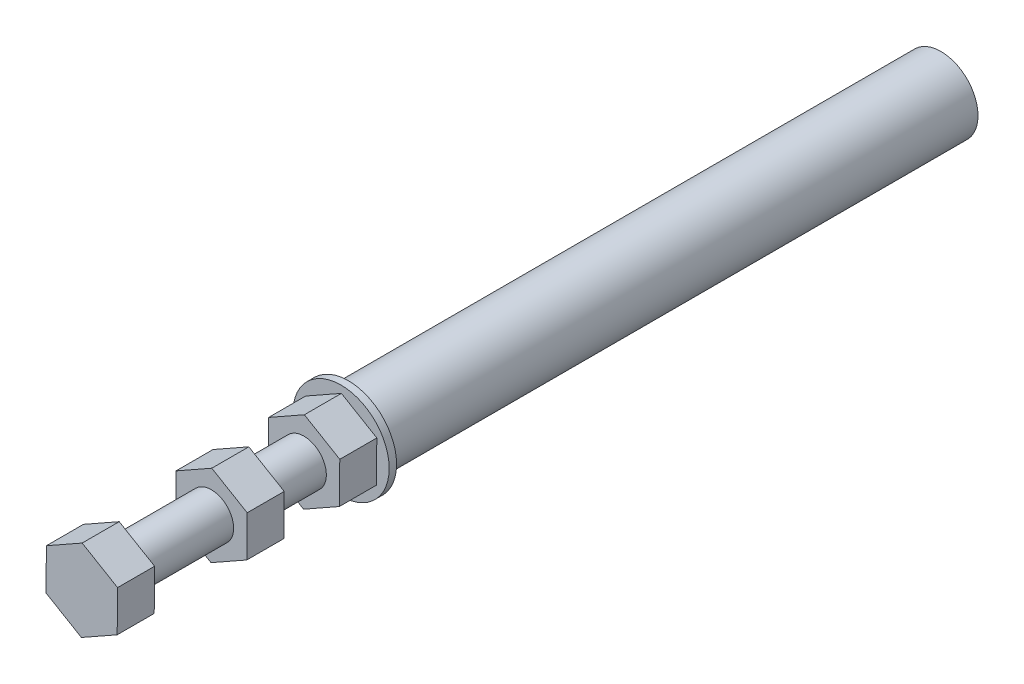
ISO-10303-21;
HEADER;
FILE_DESCRIPTION(('STEP AP214'),'2;1');
FILE_NAME('part.step','',(''),(''),'','','');
FILE_SCHEMA(('AUTOMOTIVE_DESIGN { 1 0 10303 214 1 1 1 1 }'));
ENDSEC;
DATA;
#1=APPLICATION_CONTEXT('core data for automotive mechanical design processes');
#2=APPLICATION_PROTOCOL_DEFINITION('international standard','automotive_design',2000,#1);
#3=PRODUCT_CONTEXT('',#1,'mechanical');
#4=PRODUCT('Part','Part','',(#3));
#5=PRODUCT_RELATED_PRODUCT_CATEGORY('part','',(#4));
#6=PRODUCT_DEFINITION_FORMATION('','',#4);
#7=PRODUCT_DEFINITION_CONTEXT('part definition',#1,'design');
#8=PRODUCT_DEFINITION('design','',#6,#7);
#9=PRODUCT_DEFINITION_SHAPE('','',#8);
#10=(LENGTH_UNIT() NAMED_UNIT(*) SI_UNIT(.MILLI.,.METRE.));
#11=(NAMED_UNIT(*) PLANE_ANGLE_UNIT() SI_UNIT($,.RADIAN.));
#12=(NAMED_UNIT(*) SI_UNIT($,.STERADIAN.) SOLID_ANGLE_UNIT());
#13=UNCERTAINTY_MEASURE_WITH_UNIT(LENGTH_MEASURE(1.E-05),#10,'distance_accuracy_value','');
#14=(GEOMETRIC_REPRESENTATION_CONTEXT(3) GLOBAL_UNCERTAINTY_ASSIGNED_CONTEXT((#13)) GLOBAL_UNIT_ASSIGNED_CONTEXT((#10,
#11,#12)) REPRESENTATION_CONTEXT('',''));
#15=CARTESIAN_POINT('',(0.,0.,0.));
#16=DIRECTION('',(0.,0.,1.));
#17=DIRECTION('',(1.,0.,0.));
#18=AXIS2_PLACEMENT_3D('',#15,#16,#17);
#19=CARTESIAN_POINT('',(0.,0.,80.));
#20=DIRECTION('',(0.,0.,-1.));
#21=DIRECTION('',(-1.,0.,0.));
#22=AXIS2_PLACEMENT_3D('',#19,#20,#21);
#23=CYLINDRICAL_SURFACE('',#22,5.);
#24=CARTESIAN_POINT('',(0.,0.,80.));
#25=DIRECTION('',(0.,0.,1.));
#26=DIRECTION('',(1.,0.,0.));
#27=AXIS2_PLACEMENT_3D('',#24,#25,#26);
#28=CIRCLE('',#27,5.);
#29=CARTESIAN_POINT('',(5.,0.,80.));
#30=VERTEX_POINT('',#29);
#31=EDGE_CURVE('E271',#30,#30,#28,.T.);
#32=ORIENTED_EDGE('',*,*,#31,.F.);
#33=EDGE_LOOP('',(#32));
#34=FACE_BOUND('',#33,.T.);
#35=CARTESIAN_POINT('',(0.,0.,0.));
#36=DIRECTION('',(0.,0.,1.));
#37=DIRECTION('',(1.,0.,0.));
#38=AXIS2_PLACEMENT_3D('',#35,#36,#37);
#39=CIRCLE('',#38,5.);
#40=CARTESIAN_POINT('',(5.,0.,0.));
#41=VERTEX_POINT('',#40);
#42=EDGE_CURVE('E42',#41,#41,#39,.T.);
#43=ORIENTED_EDGE('',*,*,#42,.T.);
#44=EDGE_LOOP('',(#43));
#45=FACE_BOUND('',#44,.T.);
#46=ADVANCED_FACE('F39',(#34,#45),#23,.T.);
#47=CARTESIAN_POINT('',(0.,0.,0.));
#48=DIRECTION('',(0.,0.,1.));
#49=DIRECTION('',(1.,0.,0.));
#50=AXIS2_PLACEMENT_3D('',#47,#48,#49);
#51=PLANE('',#50);
#52=ORIENTED_EDGE('',*,*,#42,.F.);
#53=EDGE_LOOP('',(#52));
#54=FACE_BOUND('',#53,.T.);
#55=ADVANCED_FACE('F350',(#54),#51,.F.);
#56=CARTESIAN_POINT('',(0.,0.,81.));
#57=DIRECTION('',(0.,0.,-1.));
#58=DIRECTION('',(-1.,0.,0.));
#59=AXIS2_PLACEMENT_3D('',#56,#57,#58);
#60=CYLINDRICAL_SURFACE('',#59,6.5);
#61=CARTESIAN_POINT('',(0.,0.,81.));
#62=DIRECTION('',(0.,0.,1.));
#63=DIRECTION('',(1.,0.,0.));
#64=AXIS2_PLACEMENT_3D('',#61,#62,#63);
#65=CIRCLE('',#64,6.5);
#66=CARTESIAN_POINT('',(6.5,0.,81.));
#67=VERTEX_POINT('',#66);
#68=EDGE_CURVE('E335',#67,#67,#65,.T.);
#69=ORIENTED_EDGE('',*,*,#68,.F.);
#70=EDGE_LOOP('',(#69));
#71=FACE_BOUND('',#70,.T.);
#72=CARTESIAN_POINT('',(0.,0.,80.));
#73=DIRECTION('',(0.,0.,1.));
#74=DIRECTION('',(1.,0.,0.));
#75=AXIS2_PLACEMENT_3D('',#72,#73,#74);
#76=CIRCLE('',#75,6.5);
#77=CARTESIAN_POINT('',(6.5,0.,80.));
#78=VERTEX_POINT('',#77);
#79=EDGE_CURVE('E334',#78,#78,#76,.T.);
#80=ORIENTED_EDGE('',*,*,#79,.T.);
#81=EDGE_LOOP('',(#80));
#82=FACE_BOUND('',#81,.T.);
#83=ADVANCED_FACE('F352',(#71,#82),#60,.T.);
#84=CARTESIAN_POINT('',(0.,0.,81.));
#85=DIRECTION('',(0.,0.,1.));
#86=DIRECTION('',(1.,0.,0.));
#87=AXIS2_PLACEMENT_3D('',#84,#85,#86);
#88=PLANE('',#87);
#89=DIRECTION('',(0.870752902483043,0.491720838298883,0.));
#90=VECTOR('',#89,1.);
#91=CARTESIAN_POINT('',(-0.0529019779904913,-5.54868495112976,81.));
#92=LINE('',#91,#90);
#93=CARTESIAN_POINT('',(-0.0529019779904913,-5.54868495112976,81.));
#94=VERTEX_POINT('',#93);
#95=CARTESIAN_POINT('',(4.77885113627954,-2.82015693241509,81.));
#96=VERTEX_POINT('',#95);
#97=EDGE_CURVE('E56',#94,#96,#92,.T.);
#98=ORIENTED_EDGE('',*,*,#97,.F.);
#99=DIRECTION('',(0.861219188778534,-0.508233714819907,0.));
#100=VECTOR('',#99,1.);
#101=CARTESIAN_POINT('',(-4.83175311427003,-2.72852801871466,81.));
#102=LINE('',#101,#100);
#103=CARTESIAN_POINT('',(-4.83175311427003,-2.72852801871466,81.));
#104=VERTEX_POINT('',#103);
#105=EDGE_CURVE('E60',#104,#94,#102,.T.);
#106=ORIENTED_EDGE('',*,*,#105,.F.);
#107=DIRECTION('',(-0.00953371370450832,-0.999954553118791,0.));
#108=VECTOR('',#107,1.);
#109=CARTESIAN_POINT('',(-4.77885113627953,2.82015693241509,81.));
#110=LINE('',#109,#108);
#111=CARTESIAN_POINT('',(-4.77885113627953,2.82015693241509,81.));
#112=VERTEX_POINT('',#111);
#113=EDGE_CURVE('E306',#112,#104,#110,.T.);
#114=ORIENTED_EDGE('',*,*,#113,.F.);
#115=DIRECTION('',(-0.870752902483043,-0.491720838298883,0.));
#116=VECTOR('',#115,1.);
#117=CARTESIAN_POINT('',(0.0529019779904962,5.54868495112976,81.));
#118=LINE('',#117,#116);
#119=CARTESIAN_POINT('',(0.0529019779904962,5.54868495112976,81.));
#120=VERTEX_POINT('',#119);
#121=EDGE_CURVE('E302',#120,#112,#118,.T.);
#122=ORIENTED_EDGE('',*,*,#121,.F.);
#123=DIRECTION('',(-0.861219188778534,0.508233714819908,0.));
#124=VECTOR('',#123,1.);
#125=CARTESIAN_POINT('',(4.83175311427003,2.72852801871466,81.));
#126=LINE('',#125,#124);
#127=CARTESIAN_POINT('',(4.83175311427003,2.72852801871466,81.));
#128=VERTEX_POINT('',#127);
#129=EDGE_CURVE('E298',#128,#120,#126,.T.);
#130=ORIENTED_EDGE('',*,*,#129,.F.);
#131=DIRECTION('',(0.00953371370450816,0.999954553118791,0.));
#132=VECTOR('',#131,1.);
#133=CARTESIAN_POINT('',(4.77885113627954,-2.82015693241509,81.));
#134=LINE('',#133,#132);
#135=EDGE_CURVE('E294',#96,#128,#134,.T.);
#136=ORIENTED_EDGE('',*,*,#135,.F.);
#137=EDGE_LOOP('',(#98,#106,#114,#122,#130,#136));
#138=FACE_BOUND('',#137,.T.);
#139=ORIENTED_EDGE('',*,*,#68,.T.);
#140=EDGE_LOOP('',(#139));
#141=FACE_BOUND('',#140,.T.);
#142=ADVANCED_FACE('F357',(#138,#141),#88,.T.);
#143=CARTESIAN_POINT('',(0.,0.,80.));
#144=DIRECTION('',(0.,0.,1.));
#145=DIRECTION('',(1.,0.,0.));
#146=AXIS2_PLACEMENT_3D('',#143,#144,#145);
#147=PLANE('',#146);
#148=ORIENTED_EDGE('',*,*,#31,.T.);
#149=EDGE_LOOP('',(#148));
#150=FACE_BOUND('',#149,.T.);
#151=ORIENTED_EDGE('',*,*,#79,.F.);
#152=EDGE_LOOP('',(#151));
#153=FACE_BOUND('',#152,.T.);
#154=ADVANCED_FACE('F362',(#150,#153),#147,.F.);
#155=CARTESIAN_POINT('',(-0.0529019779904913,-5.54868495112976,86.));
#156=DIRECTION('',(-0.491720838298883,0.870752902483043,0.));
#157=DIRECTION('',(-0.870752902483043,-0.491720838298883,0.));
#158=AXIS2_PLACEMENT_3D('',#155,#156,#157);
#159=PLANE('',#158);
#160=ORIENTED_EDGE('',*,*,#97,.T.);
#161=DIRECTION('',(0.,0.,-1.));
#162=VECTOR('',#161,1.);
#163=CARTESIAN_POINT('',(4.77885113627954,-2.82015693241509,86.));
#164=LINE('',#163,#162);
#165=CARTESIAN_POINT('',(4.77885113627954,-2.82015693241509,86.));
#166=VERTEX_POINT('',#165);
#167=EDGE_CURVE('E330',#166,#96,#164,.T.);
#168=ORIENTED_EDGE('',*,*,#167,.F.);
#169=DIRECTION('',(0.870752902483043,0.491720838298883,0.));
#170=VECTOR('',#169,1.);
#171=CARTESIAN_POINT('',(-0.0529019779904913,-5.54868495112976,86.));
#172=LINE('',#171,#170);
#173=CARTESIAN_POINT('',(-0.0529019779904913,-5.54868495112976,86.));
#174=VERTEX_POINT('',#173);
#175=EDGE_CURVE('E272',#174,#166,#172,.T.);
#176=ORIENTED_EDGE('',*,*,#175,.F.);
#177=DIRECTION('',(0.,0.,-1.));
#178=VECTOR('',#177,1.);
#179=CARTESIAN_POINT('',(-0.0529019779904913,-5.54868495112976,86.));
#180=LINE('',#179,#178);
#181=EDGE_CURVE('E291',#174,#94,#180,.T.);
#182=ORIENTED_EDGE('',*,*,#181,.T.);
#183=EDGE_LOOP('',(#160,#168,#176,#182));
#184=FACE_BOUND('',#183,.T.);
#185=ADVANCED_FACE('F365',(#184),#159,.F.);
#186=CARTESIAN_POINT('',(4.77885113627954,-2.82015693241509,86.));
#187=DIRECTION('',(-0.999954553118791,0.00953371370450817,0.));
#188=DIRECTION('',(-0.00953371370450817,-0.999954553118791,0.));
#189=AXIS2_PLACEMENT_3D('',#186,#187,#188);
#190=PLANE('',#189);
#191=ORIENTED_EDGE('',*,*,#135,.T.);
#192=DIRECTION('',(0.,0.,-1.));
#193=VECTOR('',#192,1.);
#194=CARTESIAN_POINT('',(4.83175311427003,2.72852801871466,86.));
#195=LINE('',#194,#193);
#196=CARTESIAN_POINT('',(4.83175311427003,2.72852801871466,86.));
#197=VERTEX_POINT('',#196);
#198=EDGE_CURVE('E326',#197,#128,#195,.T.);
#199=ORIENTED_EDGE('',*,*,#198,.F.);
#200=DIRECTION('',(0.00953371370450816,0.999954553118791,0.));
#201=VECTOR('',#200,1.);
#202=CARTESIAN_POINT('',(4.77885113627954,-2.82015693241509,86.));
#203=LINE('',#202,#201);
#204=EDGE_CURVE('E276',#166,#197,#203,.T.);
#205=ORIENTED_EDGE('',*,*,#204,.F.);
#206=ORIENTED_EDGE('',*,*,#167,.T.);
#207=EDGE_LOOP('',(#191,#199,#205,#206));
#208=FACE_BOUND('',#207,.T.);
#209=ADVANCED_FACE('F370',(#208),#190,.F.);
#210=CARTESIAN_POINT('',(4.83175311427003,2.72852801871466,86.));
#211=DIRECTION('',(-0.508233714819908,-0.861219188778535,0.));
#212=DIRECTION('',(0.861219188778535,-0.508233714819908,0.));
#213=AXIS2_PLACEMENT_3D('',#210,#211,#212);
#214=PLANE('',#213);
#215=ORIENTED_EDGE('',*,*,#129,.T.);
#216=DIRECTION('',(0.,0.,-1.));
#217=VECTOR('',#216,1.);
#218=CARTESIAN_POINT('',(0.0529019779904962,5.54868495112976,86.));
#219=LINE('',#218,#217);
#220=CARTESIAN_POINT('',(0.0529019779904962,5.54868495112976,86.));
#221=VERTEX_POINT('',#220);
#222=EDGE_CURVE('E322',#221,#120,#219,.T.);
#223=ORIENTED_EDGE('',*,*,#222,.F.);
#224=DIRECTION('',(-0.861219188778534,0.508233714819908,0.));
#225=VECTOR('',#224,1.);
#226=CARTESIAN_POINT('',(4.83175311427003,2.72852801871466,86.));
#227=LINE('',#226,#225);
#228=EDGE_CURVE('E279',#197,#221,#227,.T.);
#229=ORIENTED_EDGE('',*,*,#228,.F.);
#230=ORIENTED_EDGE('',*,*,#198,.T.);
#231=EDGE_LOOP('',(#215,#223,#229,#230));
#232=FACE_BOUND('',#231,.T.);
#233=ADVANCED_FACE('F374',(#232),#214,.F.);
#234=CARTESIAN_POINT('',(0.0529019779904962,5.54868495112976,86.));
#235=DIRECTION('',(0.491720838298883,-0.870752902483043,0.));
#236=DIRECTION('',(0.870752902483043,0.491720838298883,0.));
#237=AXIS2_PLACEMENT_3D('',#234,#235,#236);
#238=PLANE('',#237);
#239=ORIENTED_EDGE('',*,*,#121,.T.);
#240=DIRECTION('',(0.,0.,-1.));
#241=VECTOR('',#240,1.);
#242=CARTESIAN_POINT('',(-4.77885113627953,2.82015693241509,86.));
#243=LINE('',#242,#241);
#244=CARTESIAN_POINT('',(-4.77885113627953,2.82015693241509,86.));
#245=VERTEX_POINT('',#244);
#246=EDGE_CURVE('E318',#245,#112,#243,.T.);
#247=ORIENTED_EDGE('',*,*,#246,.F.);
#248=DIRECTION('',(-0.870752902483043,-0.491720838298883,0.));
#249=VECTOR('',#248,1.);
#250=CARTESIAN_POINT('',(0.0529019779904962,5.54868495112976,86.));
#251=LINE('',#250,#249);
#252=EDGE_CURVE('E282',#221,#245,#251,.T.);
#253=ORIENTED_EDGE('',*,*,#252,.F.);
#254=ORIENTED_EDGE('',*,*,#222,.T.);
#255=EDGE_LOOP('',(#239,#247,#253,#254));
#256=FACE_BOUND('',#255,.T.);
#257=ADVANCED_FACE('F378',(#256),#238,.F.);
#258=CARTESIAN_POINT('',(-4.77885113627953,2.82015693241509,86.));
#259=DIRECTION('',(0.999954553118791,-0.00953371370450832,0.));
#260=DIRECTION('',(0.00953371370450832,0.999954553118791,0.));
#261=AXIS2_PLACEMENT_3D('',#258,#259,#260);
#262=PLANE('',#261);
#263=ORIENTED_EDGE('',*,*,#113,.T.);
#264=DIRECTION('',(0.,0.,-1.));
#265=VECTOR('',#264,1.);
#266=CARTESIAN_POINT('',(-4.83175311427003,-2.72852801871466,86.));
#267=LINE('',#266,#265);
#268=CARTESIAN_POINT('',(-4.83175311427003,-2.72852801871466,86.));
#269=VERTEX_POINT('',#268);
#270=EDGE_CURVE('E314',#269,#104,#267,.T.);
#271=ORIENTED_EDGE('',*,*,#270,.F.);
#272=DIRECTION('',(-0.00953371370450832,-0.999954553118791,0.));
#273=VECTOR('',#272,1.);
#274=CARTESIAN_POINT('',(-4.77885113627953,2.82015693241509,86.));
#275=LINE('',#274,#273);
#276=EDGE_CURVE('E285',#245,#269,#275,.T.);
#277=ORIENTED_EDGE('',*,*,#276,.F.);
#278=ORIENTED_EDGE('',*,*,#246,.T.);
#279=EDGE_LOOP('',(#263,#271,#277,#278));
#280=FACE_BOUND('',#279,.T.);
#281=ADVANCED_FACE('F382',(#280),#262,.F.);
#282=CARTESIAN_POINT('',(-4.83175311427003,-2.72852801871466,86.));
#283=DIRECTION('',(0.508233714819907,0.861219188778535,0.));
#284=DIRECTION('',(-0.861219188778535,0.508233714819907,0.));
#285=AXIS2_PLACEMENT_3D('',#282,#283,#284);
#286=PLANE('',#285);
#287=ORIENTED_EDGE('',*,*,#105,.T.);
#288=ORIENTED_EDGE('',*,*,#181,.F.);
#289=DIRECTION('',(0.861219188778534,-0.508233714819907,0.));
#290=VECTOR('',#289,1.);
#291=CARTESIAN_POINT('',(-4.83175311427003,-2.72852801871466,86.));
#292=LINE('',#291,#290);
#293=EDGE_CURVE('E288',#269,#174,#292,.T.);
#294=ORIENTED_EDGE('',*,*,#293,.F.);
#295=ORIENTED_EDGE('',*,*,#270,.T.);
#296=EDGE_LOOP('',(#287,#288,#294,#295));
#297=FACE_BOUND('',#296,.T.);
#298=ADVANCED_FACE('F386',(#297),#286,.F.);
#299=CARTESIAN_POINT('',(0.,0.,86.));
#300=DIRECTION('',(0.,0.,1.));
#301=DIRECTION('',(1.,0.,0.));
#302=AXIS2_PLACEMENT_3D('',#299,#300,#301);
#303=PLANE('',#302);
#304=CARTESIAN_POINT('',(0.,0.,86.));
#305=DIRECTION('',(0.,0.,1.));
#306=DIRECTION('',(1.,0.,0.));
#307=AXIS2_PLACEMENT_3D('',#304,#305,#306);
#308=CIRCLE('',#307,3.01965356429047);
#309=CARTESIAN_POINT('',(3.01965356429047,0.,86.));
#310=VERTEX_POINT('',#309);
#311=EDGE_CURVE('E48',#310,#310,#308,.T.);
#312=ORIENTED_EDGE('',*,*,#311,.F.);
#313=EDGE_LOOP('',(#312));
#314=FACE_BOUND('',#313,.T.);
#315=ORIENTED_EDGE('',*,*,#175,.T.);
#316=ORIENTED_EDGE('',*,*,#204,.T.);
#317=ORIENTED_EDGE('',*,*,#228,.T.);
#318=ORIENTED_EDGE('',*,*,#252,.T.);
#319=ORIENTED_EDGE('',*,*,#276,.T.);
#320=ORIENTED_EDGE('',*,*,#293,.T.);
#321=EDGE_LOOP('',(#315,#316,#317,#318,#319,#320));
#322=FACE_BOUND('',#321,.T.);
#323=ADVANCED_FACE('F390',(#314,#322),#303,.T.);
#324=CARTESIAN_POINT('',(0.,0.,93.5));
#325=DIRECTION('',(0.,0.,-1.));
#326=DIRECTION('',(-1.,0.,0.));
#327=AXIS2_PLACEMENT_3D('',#324,#325,#326);
#328=CYLINDRICAL_SURFACE('',#327,3.01965356429047);
#329=CARTESIAN_POINT('',(0.,0.,93.5));
#330=DIRECTION('',(0.,0.,1.));
#331=DIRECTION('',(1.,0.,0.));
#332=AXIS2_PLACEMENT_3D('',#329,#330,#331);
#333=CIRCLE('',#332,3.01965356429047);
#334=CARTESIAN_POINT('',(3.01965356429047,0.,93.5));
#335=VERTEX_POINT('',#334);
#336=EDGE_CURVE('E264',#335,#335,#333,.T.);
#337=ORIENTED_EDGE('',*,*,#336,.F.);
#338=EDGE_LOOP('',(#337));
#339=FACE_BOUND('',#338,.T.);
#340=ORIENTED_EDGE('',*,*,#311,.T.);
#341=EDGE_LOOP('',(#340));
#342=FACE_BOUND('',#341,.T.);
#343=ADVANCED_FACE('F394',(#339,#342),#328,.T.);
#344=CARTESIAN_POINT('',(-0.0529019779904484,-5.54868495112975,98.5));
#345=DIRECTION('',(-0.49172083829889,0.870752902483039,0.));
#346=DIRECTION('',(-0.870752902483039,-0.49172083829889,0.));
#347=AXIS2_PLACEMENT_3D('',#344,#345,#346);
#348=PLANE('',#347);
#349=DIRECTION('',(0.870752902483039,0.49172083829889,0.));
#350=VECTOR('',#349,1.);
#351=CARTESIAN_POINT('',(-0.0529019779904484,-5.54868495112975,93.5));
#352=LINE('',#351,#350);
#353=CARTESIAN_POINT('',(-0.0529019779904484,-5.54868495112975,93.5));
#354=VERTEX_POINT('',#353);
#355=CARTESIAN_POINT('',(4.77885113627956,-2.82015693241505,93.5));
#356=VERTEX_POINT('',#355);
#357=EDGE_CURVE('E197',#354,#356,#352,.T.);
#358=ORIENTED_EDGE('',*,*,#357,.T.);
#359=DIRECTION('',(0.,0.,-1.));
#360=VECTOR('',#359,1.);
#361=CARTESIAN_POINT('',(4.77885113627956,-2.82015693241505,98.5));
#362=LINE('',#361,#360);
#363=CARTESIAN_POINT('',(4.77885113627956,-2.82015693241505,98.5));
#364=VERTEX_POINT('',#363);
#365=EDGE_CURVE('E260',#364,#356,#362,.T.);
#366=ORIENTED_EDGE('',*,*,#365,.F.);
#367=DIRECTION('',(0.870752902483039,0.49172083829889,0.));
#368=VECTOR('',#367,1.);
#369=CARTESIAN_POINT('',(-0.0529019779904484,-5.54868495112975,98.5));
#370=LINE('',#369,#368);
#371=CARTESIAN_POINT('',(-0.0529019779904484,-5.54868495112975,98.5));
#372=VERTEX_POINT('',#371);
#373=EDGE_CURVE('E203',#372,#364,#370,.T.);
#374=ORIENTED_EDGE('',*,*,#373,.F.);
#375=DIRECTION('',(0.,0.,-1.));
#376=VECTOR('',#375,1.);
#377=CARTESIAN_POINT('',(-0.0529019779904484,-5.54868495112975,98.5));
#378=LINE('',#377,#376);
#379=EDGE_CURVE('E223',#372,#354,#378,.T.);
#380=ORIENTED_EDGE('',*,*,#379,.T.);
#381=EDGE_LOOP('',(#358,#366,#374,#380));
#382=FACE_BOUND('',#381,.T.);
#383=ADVANCED_FACE('F398',(#382),#348,.F.);
#384=CARTESIAN_POINT('',(4.77885113627956,-2.82015693241505,98.5));
#385=DIRECTION('',(-0.999954553118791,0.00953371370450004,0.));
#386=DIRECTION('',(-0.00953371370450004,-0.999954553118791,0.));
#387=AXIS2_PLACEMENT_3D('',#384,#385,#386);
#388=PLANE('',#387);
#389=DIRECTION('',(0.00953371370450004,0.999954553118791,0.));
#390=VECTOR('',#389,1.);
#391=CARTESIAN_POINT('',(4.77885113627956,-2.82015693241505,93.5));
#392=LINE('',#391,#390);
#393=CARTESIAN_POINT('',(4.83175311427001,2.7285280187147,93.5));
#394=VERTEX_POINT('',#393);
#395=EDGE_CURVE('E227',#356,#394,#392,.T.);
#396=ORIENTED_EDGE('',*,*,#395,.T.);
#397=DIRECTION('',(0.,0.,-1.));
#398=VECTOR('',#397,1.);
#399=CARTESIAN_POINT('',(4.83175311427001,2.7285280187147,98.5));
#400=LINE('',#399,#398);
#401=CARTESIAN_POINT('',(4.83175311427001,2.7285280187147,98.5));
#402=VERTEX_POINT('',#401);
#403=EDGE_CURVE('E256',#402,#394,#400,.T.);
#404=ORIENTED_EDGE('',*,*,#403,.F.);
#405=DIRECTION('',(0.00953371370450004,0.999954553118791,0.));
#406=VECTOR('',#405,1.);
#407=CARTESIAN_POINT('',(4.77885113627956,-2.82015693241505,98.5));
#408=LINE('',#407,#406);
#409=EDGE_CURVE('E207',#364,#402,#408,.T.);
#410=ORIENTED_EDGE('',*,*,#409,.F.);
#411=ORIENTED_EDGE('',*,*,#365,.T.);
#412=EDGE_LOOP('',(#396,#404,#410,#411));
#413=FACE_BOUND('',#412,.T.);
#414=ADVANCED_FACE('F402',(#413),#388,.F.);
#415=CARTESIAN_POINT('',(4.83175311427001,2.7285280187147,98.5));
#416=DIRECTION('',(-0.508233714819901,-0.861219188778539,0.));
#417=DIRECTION('',(0.861219188778539,-0.508233714819901,0.));
#418=AXIS2_PLACEMENT_3D('',#415,#416,#417);
#419=PLANE('',#418);
#420=DIRECTION('',(-0.861219188778538,0.508233714819901,0.));
#421=VECTOR('',#420,1.);
#422=CARTESIAN_POINT('',(4.83175311427001,2.7285280187147,93.5));
#423=LINE('',#422,#421);
#424=CARTESIAN_POINT('',(0.052901977990451,5.54868495112975,93.5));
#425=VERTEX_POINT('',#424);
#426=EDGE_CURVE('E230',#394,#425,#423,.T.);
#427=ORIENTED_EDGE('',*,*,#426,.T.);
#428=DIRECTION('',(0.,0.,-1.));
#429=VECTOR('',#428,1.);
#430=CARTESIAN_POINT('',(0.052901977990451,5.54868495112975,98.5));
#431=LINE('',#430,#429);
#432=CARTESIAN_POINT('',(0.052901977990451,5.54868495112975,98.5));
#433=VERTEX_POINT('',#432);
#434=EDGE_CURVE('E252',#433,#425,#431,.T.);
#435=ORIENTED_EDGE('',*,*,#434,.F.);
#436=DIRECTION('',(-0.861219188778538,0.508233714819901,0.));
#437=VECTOR('',#436,1.);
#438=CARTESIAN_POINT('',(4.83175311427001,2.7285280187147,98.5));
#439=LINE('',#438,#437);
#440=EDGE_CURVE('E211',#402,#433,#439,.T.);
#441=ORIENTED_EDGE('',*,*,#440,.F.);
#442=ORIENTED_EDGE('',*,*,#403,.T.);
#443=EDGE_LOOP('',(#427,#435,#441,#442));
#444=FACE_BOUND('',#443,.T.);
#445=ADVANCED_FACE('F406',(#444),#419,.F.);
#446=CARTESIAN_POINT('',(0.052901977990451,5.54868495112975,98.5));
#447=DIRECTION('',(0.49172083829889,-0.870752902483039,0.));
#448=DIRECTION('',(0.870752902483039,0.49172083829889,0.));
#449=AXIS2_PLACEMENT_3D('',#446,#447,#448);
#450=PLANE('',#449);
#451=DIRECTION('',(-0.870752902483039,-0.49172083829889,0.));
#452=VECTOR('',#451,1.);
#453=CARTESIAN_POINT('',(0.052901977990451,5.54868495112975,93.5));
#454=LINE('',#453,#452);
#455=CARTESIAN_POINT('',(-4.77885113627956,2.82015693241505,93.5));
#456=VERTEX_POINT('',#455);
#457=EDGE_CURVE('E233',#425,#456,#454,.T.);
#458=ORIENTED_EDGE('',*,*,#457,.T.);
#459=DIRECTION('',(0.,0.,-1.));
#460=VECTOR('',#459,1.);
#461=CARTESIAN_POINT('',(-4.77885113627956,2.82015693241505,98.5));
#462=LINE('',#461,#460);
#463=CARTESIAN_POINT('',(-4.77885113627956,2.82015693241505,98.5));
#464=VERTEX_POINT('',#463);
#465=EDGE_CURVE('E248',#464,#456,#462,.T.);
#466=ORIENTED_EDGE('',*,*,#465,.F.);
#467=DIRECTION('',(-0.870752902483039,-0.49172083829889,0.));
#468=VECTOR('',#467,1.);
#469=CARTESIAN_POINT('',(0.052901977990451,5.54868495112975,98.5));
#470=LINE('',#469,#468);
#471=EDGE_CURVE('E214',#433,#464,#470,.T.);
#472=ORIENTED_EDGE('',*,*,#471,.F.);
#473=ORIENTED_EDGE('',*,*,#434,.T.);
#474=EDGE_LOOP('',(#458,#466,#472,#473));
#475=FACE_BOUND('',#474,.T.);
#476=ADVANCED_FACE('F410',(#475),#450,.F.);
#477=CARTESIAN_POINT('',(-4.77885113627956,2.82015693241505,98.5));
#478=DIRECTION('',(0.999954553118791,-0.00953371370450036,0.));
#479=DIRECTION('',(0.00953371370450036,0.999954553118791,0.));
#480=AXIS2_PLACEMENT_3D('',#477,#478,#479);
#481=PLANE('',#480);
#482=DIRECTION('',(-0.00953371370450036,-0.999954553118791,0.));
#483=VECTOR('',#482,1.);
#484=CARTESIAN_POINT('',(-4.77885113627956,2.82015693241505,93.5));
#485=LINE('',#484,#483);
#486=CARTESIAN_POINT('',(-4.83175311427001,-2.7285280187147,93.5));
#487=VERTEX_POINT('',#486);
#488=EDGE_CURVE('E236',#456,#487,#485,.T.);
#489=ORIENTED_EDGE('',*,*,#488,.T.);
#490=DIRECTION('',(0.,0.,-1.));
#491=VECTOR('',#490,1.);
#492=CARTESIAN_POINT('',(-4.83175311427001,-2.7285280187147,98.5));
#493=LINE('',#492,#491);
#494=CARTESIAN_POINT('',(-4.83175311427001,-2.7285280187147,98.5));
#495=VERTEX_POINT('',#494);
#496=EDGE_CURVE('E244',#495,#487,#493,.T.);
#497=ORIENTED_EDGE('',*,*,#496,.F.);
#498=DIRECTION('',(-0.00953371370450036,-0.999954553118791,0.));
#499=VECTOR('',#498,1.);
#500=CARTESIAN_POINT('',(-4.77885113627956,2.82015693241505,98.5));
#501=LINE('',#500,#499);
#502=EDGE_CURVE('E217',#464,#495,#501,.T.);
#503=ORIENTED_EDGE('',*,*,#502,.F.);
#504=ORIENTED_EDGE('',*,*,#465,.T.);
#505=EDGE_LOOP('',(#489,#497,#503,#504));
#506=FACE_BOUND('',#505,.T.);
#507=ADVANCED_FACE('F414',(#506),#481,.F.);
#508=CARTESIAN_POINT('',(-4.83175311427001,-2.7285280187147,98.5));
#509=DIRECTION('',(0.508233714819901,0.861219188778539,0.));
#510=DIRECTION('',(-0.861219188778539,0.508233714819901,0.));
#511=AXIS2_PLACEMENT_3D('',#508,#509,#510);
#512=PLANE('',#511);
#513=DIRECTION('',(0.861219188778539,-0.508233714819901,0.));
#514=VECTOR('',#513,1.);
#515=CARTESIAN_POINT('',(-4.83175311427001,-2.7285280187147,93.5));
#516=LINE('',#515,#514);
#517=EDGE_CURVE('E208',#487,#354,#516,.T.);
#518=ORIENTED_EDGE('',*,*,#517,.T.);
#519=ORIENTED_EDGE('',*,*,#379,.F.);
#520=DIRECTION('',(0.861219188778539,-0.508233714819901,0.));
#521=VECTOR('',#520,1.);
#522=CARTESIAN_POINT('',(-4.83175311427001,-2.7285280187147,98.5));
#523=LINE('',#522,#521);
#524=EDGE_CURVE('E220',#495,#372,#523,.T.);
#525=ORIENTED_EDGE('',*,*,#524,.F.);
#526=ORIENTED_EDGE('',*,*,#496,.T.);
#527=EDGE_LOOP('',(#518,#519,#525,#526));
#528=FACE_BOUND('',#527,.T.);
#529=ADVANCED_FACE('F418',(#528),#512,.F.);
#530=CARTESIAN_POINT('',(0.,0.,98.5));
#531=DIRECTION('',(0.,0.,1.));
#532=DIRECTION('',(1.,0.,0.));
#533=AXIS2_PLACEMENT_3D('',#530,#531,#532);
#534=PLANE('',#533);
#535=CARTESIAN_POINT('',(0.,0.,98.5));
#536=DIRECTION('',(0.,0.,1.));
#537=DIRECTION('',(1.,0.,0.));
#538=AXIS2_PLACEMENT_3D('',#535,#536,#537);
#539=CIRCLE('',#538,3.);
#540=CARTESIAN_POINT('',(3.,0.,98.5));
#541=VERTEX_POINT('',#540);
#542=EDGE_CURVE('E11',#541,#541,#539,.T.);
#543=ORIENTED_EDGE('',*,*,#542,.F.);
#544=EDGE_LOOP('',(#543));
#545=FACE_BOUND('',#544,.T.);
#546=ORIENTED_EDGE('',*,*,#373,.T.);
#547=ORIENTED_EDGE('',*,*,#409,.T.);
#548=ORIENTED_EDGE('',*,*,#440,.T.);
#549=ORIENTED_EDGE('',*,*,#471,.T.);
#550=ORIENTED_EDGE('',*,*,#502,.T.);
#551=ORIENTED_EDGE('',*,*,#524,.T.);
#552=EDGE_LOOP('',(#546,#547,#548,#549,#550,#551));
#553=FACE_BOUND('',#552,.T.);
#554=ADVANCED_FACE('F422',(#545,#553),#534,.T.);
#555=CARTESIAN_POINT('',(0.,0.,93.5));
#556=DIRECTION('',(0.,0.,1.));
#557=DIRECTION('',(1.,0.,0.));
#558=AXIS2_PLACEMENT_3D('',#555,#556,#557);
#559=PLANE('',#558);
#560=ORIENTED_EDGE('',*,*,#336,.T.);
#561=EDGE_LOOP('',(#560));
#562=FACE_BOUND('',#561,.T.);
#563=ORIENTED_EDGE('',*,*,#357,.F.);
#564=ORIENTED_EDGE('',*,*,#517,.F.);
#565=ORIENTED_EDGE('',*,*,#488,.F.);
#566=ORIENTED_EDGE('',*,*,#457,.F.);
#567=ORIENTED_EDGE('',*,*,#426,.F.);
#568=ORIENTED_EDGE('',*,*,#395,.F.);
#569=EDGE_LOOP('',(#563,#564,#565,#566,#567,#568));
#570=FACE_BOUND('',#569,.T.);
#571=ADVANCED_FACE('F424',(#562,#570),#559,.F.);
#572=CARTESIAN_POINT('',(0.,0.,111.));
#573=DIRECTION('',(0.,0.,-1.));
#574=DIRECTION('',(-1.,0.,0.));
#575=AXIS2_PLACEMENT_3D('',#572,#573,#574);
#576=CYLINDRICAL_SURFACE('',#575,3.);
#577=CARTESIAN_POINT('',(0.,0.,111.));
#578=DIRECTION('',(0.,0.,1.));
#579=DIRECTION('',(1.,0.,0.));
#580=AXIS2_PLACEMENT_3D('',#577,#578,#579);
#581=CIRCLE('',#580,3.);
#582=CARTESIAN_POINT('',(3.,0.,111.));
#583=VERTEX_POINT('',#582);
#584=EDGE_CURVE('E192',#583,#583,#581,.T.);
#585=ORIENTED_EDGE('',*,*,#584,.F.);
#586=EDGE_LOOP('',(#585));
#587=FACE_BOUND('',#586,.T.);
#588=ORIENTED_EDGE('',*,*,#542,.T.);
#589=EDGE_LOOP('',(#588));
#590=FACE_BOUND('',#589,.T.);
#591=ADVANCED_FACE('F427',(#587,#590),#576,.T.);
#592=CARTESIAN_POINT('',(-0.0529019779904484,-5.54868495112975,116.));
#593=DIRECTION('',(-0.49172083829889,0.870752902483039,0.));
#594=DIRECTION('',(-0.870752902483039,-0.49172083829889,0.));
#595=AXIS2_PLACEMENT_3D('',#592,#593,#594);
#596=PLANE('',#595);
#597=DIRECTION('',(0.870752902483039,0.49172083829889,0.));
#598=VECTOR('',#597,1.);
#599=CARTESIAN_POINT('',(-0.0529019779904484,-5.54868495112975,111.));
#600=LINE('',#599,#598);
#601=CARTESIAN_POINT('',(-0.0529019779904484,-5.54868495112975,111.));
#602=VERTEX_POINT('',#601);
#603=CARTESIAN_POINT('',(4.77885113627956,-2.82015693241505,111.));
#604=VERTEX_POINT('',#603);
#605=EDGE_CURVE('E190',#602,#604,#600,.T.);
#606=ORIENTED_EDGE('',*,*,#605,.T.);
#607=DIRECTION('',(0.,0.,-1.));
#608=VECTOR('',#607,1.);
#609=CARTESIAN_POINT('',(4.77885113627956,-2.82015693241505,116.));
#610=LINE('',#609,#608);
#611=CARTESIAN_POINT('',(4.77885113627956,-2.82015693241505,116.));
#612=VERTEX_POINT('',#611);
#613=EDGE_CURVE('E168',#612,#604,#610,.T.);
#614=ORIENTED_EDGE('',*,*,#613,.F.);
#615=DIRECTION('',(0.870752902483039,0.49172083829889,0.));
#616=VECTOR('',#615,1.);
#617=CARTESIAN_POINT('',(-0.0529019779904484,-5.54868495112975,116.));
#618=LINE('',#617,#616);
#619=CARTESIAN_POINT('',(-0.0529019779904484,-5.54868495112975,116.));
#620=VERTEX_POINT('',#619);
#621=EDGE_CURVE('E176',#620,#612,#618,.T.);
#622=ORIENTED_EDGE('',*,*,#621,.F.);
#623=DIRECTION('',(0.,0.,-1.));
#624=VECTOR('',#623,1.);
#625=CARTESIAN_POINT('',(-0.0529019779904484,-5.54868495112975,116.));
#626=LINE('',#625,#624);
#627=EDGE_CURVE('E662',#620,#602,#626,.T.);
#628=ORIENTED_EDGE('',*,*,#627,.T.);
#629=EDGE_LOOP('',(#606,#614,#622,#628));
#630=FACE_BOUND('',#629,.T.);
#631=ADVANCED_FACE('F188',(#630),#596,.F.);
#632=CARTESIAN_POINT('',(4.77885113627956,-2.82015693241505,116.));
#633=DIRECTION('',(-0.999954553118791,0.00953371370450004,0.));
#634=DIRECTION('',(-0.00953371370450004,-0.999954553118791,0.));
#635=AXIS2_PLACEMENT_3D('',#632,#633,#634);
#636=PLANE('',#635);
#637=DIRECTION('',(0.00953371370450004,0.999954553118791,0.));
#638=VECTOR('',#637,1.);
#639=CARTESIAN_POINT('',(4.77885113627956,-2.82015693241505,111.));
#640=LINE('',#639,#638);
#641=CARTESIAN_POINT('',(4.83175311427001,2.7285280187147,111.));
#642=VERTEX_POINT('',#641);
#643=EDGE_CURVE('E643',#604,#642,#640,.T.);
#644=ORIENTED_EDGE('',*,*,#643,.T.);
#645=DIRECTION('',(0.,0.,-1.));
#646=VECTOR('',#645,1.);
#647=CARTESIAN_POINT('',(4.83175311427001,2.7285280187147,116.));
#648=LINE('',#647,#646);
#649=CARTESIAN_POINT('',(4.83175311427001,2.7285280187147,116.));
#650=VERTEX_POINT('',#649);
#651=EDGE_CURVE('E171',#650,#642,#648,.T.);
#652=ORIENTED_EDGE('',*,*,#651,.F.);
#653=DIRECTION('',(0.00953371370450004,0.999954553118791,0.));
#654=VECTOR('',#653,1.);
#655=CARTESIAN_POINT('',(4.77885113627956,-2.82015693241505,116.));
#656=LINE('',#655,#654);
#657=EDGE_CURVE('E164',#612,#650,#656,.T.);
#658=ORIENTED_EDGE('',*,*,#657,.F.);
#659=ORIENTED_EDGE('',*,*,#613,.T.);
#660=EDGE_LOOP('',(#644,#652,#658,#659));
#661=FACE_BOUND('',#660,.T.);
#662=ADVANCED_FACE('F166',(#661),#636,.F.);
#663=CARTESIAN_POINT('',(4.83175311427001,2.7285280187147,116.));
#664=DIRECTION('',(-0.508233714819901,-0.861219188778539,0.));
#665=DIRECTION('',(0.861219188778539,-0.508233714819901,0.));
#666=AXIS2_PLACEMENT_3D('',#663,#664,#665);
#667=PLANE('',#666);
#668=DIRECTION('',(-0.861219188778538,0.508233714819901,0.));
#669=VECTOR('',#668,1.);
#670=CARTESIAN_POINT('',(4.83175311427001,2.7285280187147,111.));
#671=LINE('',#670,#669);
#672=CARTESIAN_POINT('',(0.052901977990451,5.54868495112975,111.));
#673=VERTEX_POINT('',#672);
#674=EDGE_CURVE('E647',#642,#673,#671,.T.);
#675=ORIENTED_EDGE('',*,*,#674,.T.);
#676=DIRECTION('',(0.,0.,-1.));
#677=VECTOR('',#676,1.);
#678=CARTESIAN_POINT('',(0.052901977990451,5.54868495112975,116.));
#679=LINE('',#678,#677);
#680=CARTESIAN_POINT('',(0.052901977990451,5.54868495112975,116.));
#681=VERTEX_POINT('',#680);
#682=EDGE_CURVE('E199',#681,#673,#679,.T.);
#683=ORIENTED_EDGE('',*,*,#682,.F.);
#684=DIRECTION('',(-0.861219188778538,0.508233714819901,0.));
#685=VECTOR('',#684,1.);
#686=CARTESIAN_POINT('',(4.83175311427001,2.7285280187147,116.));
#687=LINE('',#686,#685);
#688=EDGE_CURVE('E175',#650,#681,#687,.T.);
#689=ORIENTED_EDGE('',*,*,#688,.F.);
#690=ORIENTED_EDGE('',*,*,#651,.T.);
#691=EDGE_LOOP('',(#675,#683,#689,#690));
#692=FACE_BOUND('',#691,.T.);
#693=ADVANCED_FACE('F439',(#692),#667,.F.);
#694=CARTESIAN_POINT('',(0.052901977990451,5.54868495112975,116.));
#695=DIRECTION('',(0.49172083829889,-0.870752902483039,0.));
#696=DIRECTION('',(0.870752902483039,0.49172083829889,0.));
#697=AXIS2_PLACEMENT_3D('',#694,#695,#696);
#698=PLANE('',#697);
#699=DIRECTION('',(-0.870752902483039,-0.49172083829889,0.));
#700=VECTOR('',#699,1.);
#701=CARTESIAN_POINT('',(0.052901977990451,5.54868495112975,111.));
#702=LINE('',#701,#700);
#703=CARTESIAN_POINT('',(-4.77885113627956,2.82015693241505,111.));
#704=VERTEX_POINT('',#703);
#705=EDGE_CURVE('E654',#673,#704,#702,.T.);
#706=ORIENTED_EDGE('',*,*,#705,.T.);
#707=DIRECTION('',(0.,0.,-1.));
#708=VECTOR('',#707,1.);
#709=CARTESIAN_POINT('',(-4.77885113627956,2.82015693241505,116.));
#710=LINE('',#709,#708);
#711=CARTESIAN_POINT('',(-4.77885113627956,2.82015693241505,116.));
#712=VERTEX_POINT('',#711);
#713=EDGE_CURVE('E669',#712,#704,#710,.T.);
#714=ORIENTED_EDGE('',*,*,#713,.F.);
#715=DIRECTION('',(-0.870752902483039,-0.49172083829889,0.));
#716=VECTOR('',#715,1.);
#717=CARTESIAN_POINT('',(0.052901977990451,5.54868495112975,116.));
#718=LINE('',#717,#716);
#719=EDGE_CURVE('E678',#681,#712,#718,.T.);
#720=ORIENTED_EDGE('',*,*,#719,.F.);
#721=ORIENTED_EDGE('',*,*,#682,.T.);
#722=EDGE_LOOP('',(#706,#714,#720,#721));
#723=FACE_BOUND('',#722,.T.);
#724=ADVANCED_FACE('F442',(#723),#698,.F.);
#725=CARTESIAN_POINT('',(-4.77885113627956,2.82015693241505,116.));
#726=DIRECTION('',(0.999954553118791,-0.00953371370450036,0.));
#727=DIRECTION('',(0.00953371370450036,0.999954553118791,0.));
#728=AXIS2_PLACEMENT_3D('',#725,#726,#727);
#729=PLANE('',#728);
#730=DIRECTION('',(-0.00953371370450036,-0.999954553118791,0.));
#731=VECTOR('',#730,1.);
#732=CARTESIAN_POINT('',(-4.77885113627956,2.82015693241505,111.));
#733=LINE('',#732,#731);
#734=CARTESIAN_POINT('',(-4.83175311427001,-2.7285280187147,111.));
#735=VERTEX_POINT('',#734);
#736=EDGE_CURVE('E657',#704,#735,#733,.T.);
#737=ORIENTED_EDGE('',*,*,#736,.T.);
#738=DIRECTION('',(0.,0.,-1.));
#739=VECTOR('',#738,1.);
#740=CARTESIAN_POINT('',(-4.83175311427001,-2.7285280187147,116.));
#741=LINE('',#740,#739);
#742=CARTESIAN_POINT('',(-4.83175311427001,-2.7285280187147,116.));
#743=VERTEX_POINT('',#742);
#744=EDGE_CURVE('E665',#743,#735,#741,.T.);
#745=ORIENTED_EDGE('',*,*,#744,.F.);
#746=DIRECTION('',(-0.00953371370450036,-0.999954553118791,0.));
#747=VECTOR('',#746,1.);
#748=CARTESIAN_POINT('',(-4.77885113627956,2.82015693241505,116.));
#749=LINE('',#748,#747);
#750=EDGE_CURVE('E682',#712,#743,#749,.T.);
#751=ORIENTED_EDGE('',*,*,#750,.F.);
#752=ORIENTED_EDGE('',*,*,#713,.T.);
#753=EDGE_LOOP('',(#737,#745,#751,#752));
#754=FACE_BOUND('',#753,.T.);
#755=ADVANCED_FACE('F446',(#754),#729,.F.);
#756=CARTESIAN_POINT('',(-4.83175311427001,-2.7285280187147,116.));
#757=DIRECTION('',(0.508233714819901,0.861219188778539,0.));
#758=DIRECTION('',(-0.861219188778539,0.508233714819901,0.));
#759=AXIS2_PLACEMENT_3D('',#756,#757,#758);
#760=PLANE('',#759);
#761=DIRECTION('',(0.861219188778539,-0.508233714819901,0.));
#762=VECTOR('',#761,1.);
#763=CARTESIAN_POINT('',(-4.83175311427001,-2.7285280187147,111.));
#764=LINE('',#763,#762);
#765=EDGE_CURVE('E186',#735,#602,#764,.T.);
#766=ORIENTED_EDGE('',*,*,#765,.T.);
#767=ORIENTED_EDGE('',*,*,#627,.F.);
#768=DIRECTION('',(0.861219188778539,-0.508233714819901,0.));
#769=VECTOR('',#768,1.);
#770=CARTESIAN_POINT('',(-4.83175311427001,-2.7285280187147,116.));
#771=LINE('',#770,#769);
#772=EDGE_CURVE('E181',#743,#620,#771,.T.);
#773=ORIENTED_EDGE('',*,*,#772,.F.);
#774=ORIENTED_EDGE('',*,*,#744,.T.);
#775=EDGE_LOOP('',(#766,#767,#773,#774));
#776=FACE_BOUND('',#775,.T.);
#777=ADVANCED_FACE('F450',(#776),#760,.F.);
#778=CARTESIAN_POINT('',(0.,0.,116.));
#779=DIRECTION('',(0.,0.,1.));
#780=DIRECTION('',(1.,0.,0.));
#781=AXIS2_PLACEMENT_3D('',#778,#779,#780);
#782=PLANE('',#781);
#783=ORIENTED_EDGE('',*,*,#621,.T.);
#784=ORIENTED_EDGE('',*,*,#657,.T.);
#785=ORIENTED_EDGE('',*,*,#688,.T.);
#786=ORIENTED_EDGE('',*,*,#719,.T.);
#787=ORIENTED_EDGE('',*,*,#750,.T.);
#788=ORIENTED_EDGE('',*,*,#772,.T.);
#789=EDGE_LOOP('',(#783,#784,#785,#786,#787,#788));
#790=FACE_BOUND('',#789,.T.);
#791=ADVANCED_FACE('F179',(#790),#782,.T.);
#792=CARTESIAN_POINT('',(0.,0.,111.));
#793=DIRECTION('',(0.,0.,1.));
#794=DIRECTION('',(1.,0.,0.));
#795=AXIS2_PLACEMENT_3D('',#792,#793,#794);
#796=PLANE('',#795);
#797=ORIENTED_EDGE('',*,*,#584,.T.);
#798=EDGE_LOOP('',(#797));
#799=FACE_BOUND('',#798,.T.);
#800=ORIENTED_EDGE('',*,*,#605,.F.);
#801=ORIENTED_EDGE('',*,*,#765,.F.);
#802=ORIENTED_EDGE('',*,*,#736,.F.);
#803=ORIENTED_EDGE('',*,*,#705,.F.);
#804=ORIENTED_EDGE('',*,*,#674,.F.);
#805=ORIENTED_EDGE('',*,*,#643,.F.);
#806=EDGE_LOOP('',(#800,#801,#802,#803,#804,#805));
#807=FACE_BOUND('',#806,.T.);
#808=ADVANCED_FACE('F455',(#799,#807),#796,.F.);
#809=CLOSED_SHELL('',(#46,#55,#83,#142,#154,#185,#209,#233,#257,#281,#298,#323,#343,#383,#414,
#445,#476,#507,#529,#554,#571,#591,#631,#662,#693,#724,#755,#777,#791,#808));
#810=MANIFOLD_SOLID_BREP('B2',#809);
#811=ADVANCED_BREP_SHAPE_REPRESENTATION('',(#18,#810),#14);
#812=SHAPE_DEFINITION_REPRESENTATION(#9,#811);
ENDSEC;
END-ISO-10303-21;
